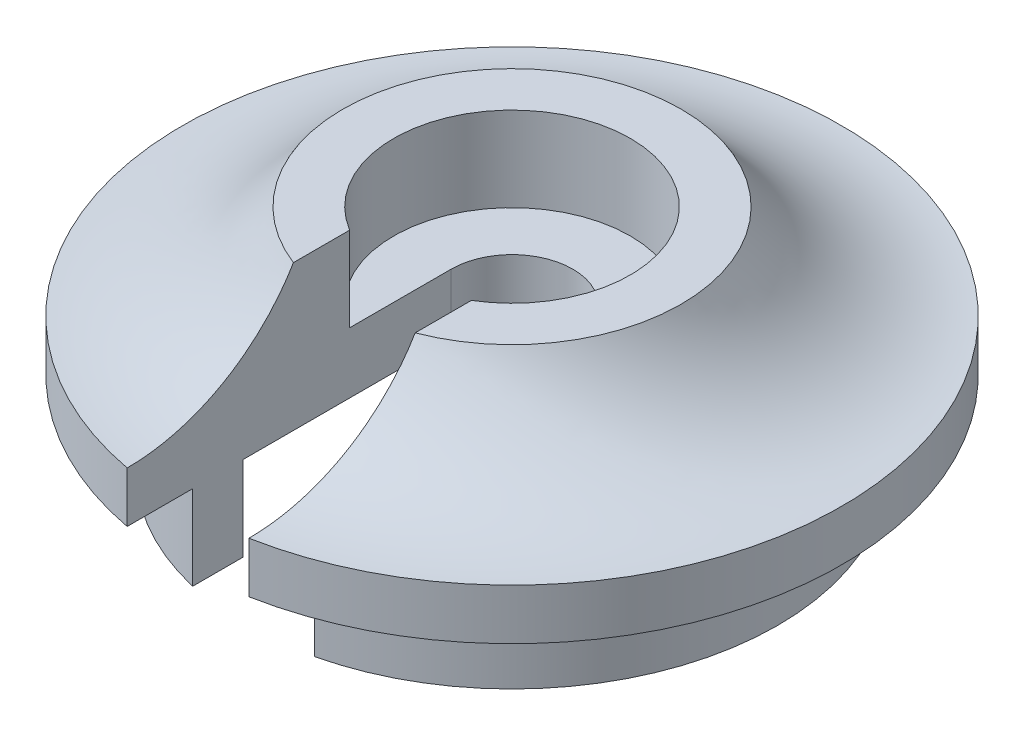
ISO-10303-21;
HEADER;
FILE_DESCRIPTION(('STEP AP214'),'2;1');
FILE_NAME('part.step','',(''),(''),'','','');
FILE_SCHEMA(('AUTOMOTIVE_DESIGN { 1 0 10303 214 1 1 1 1 }'));
ENDSEC;
DATA;
#1=APPLICATION_CONTEXT('core data for automotive mechanical design processes');
#2=APPLICATION_PROTOCOL_DEFINITION('international standard','automotive_design',2000,#1);
#3=PRODUCT_CONTEXT('',#1,'mechanical');
#4=PRODUCT('Part','Part','',(#3));
#5=PRODUCT_RELATED_PRODUCT_CATEGORY('part','',(#4));
#6=PRODUCT_DEFINITION_FORMATION('','',#4);
#7=PRODUCT_DEFINITION_CONTEXT('part definition',#1,'design');
#8=PRODUCT_DEFINITION('design','',#6,#7);
#9=PRODUCT_DEFINITION_SHAPE('','',#8);
#10=(LENGTH_UNIT() NAMED_UNIT(*) SI_UNIT(.MILLI.,.METRE.));
#11=(NAMED_UNIT(*) PLANE_ANGLE_UNIT() SI_UNIT($,.RADIAN.));
#12=(NAMED_UNIT(*) SI_UNIT($,.STERADIAN.) SOLID_ANGLE_UNIT());
#13=UNCERTAINTY_MEASURE_WITH_UNIT(LENGTH_MEASURE(1.E-05),#10,'distance_accuracy_value','');
#14=(GEOMETRIC_REPRESENTATION_CONTEXT(3) GLOBAL_UNCERTAINTY_ASSIGNED_CONTEXT((#13)) GLOBAL_UNIT_ASSIGNED_CONTEXT((#10,
#11,#12)) REPRESENTATION_CONTEXT('',''));
#15=CARTESIAN_POINT('',(0.,0.,0.));
#16=DIRECTION('',(0.,0.,1.));
#17=DIRECTION('',(1.,0.,0.));
#18=AXIS2_PLACEMENT_3D('',#15,#16,#17);
#19=CARTESIAN_POINT('',(0.,1.8,0.));
#20=DIRECTION('',(0.,-1.,0.));
#21=DIRECTION('',(0.,0.,-1.));
#22=AXIS2_PLACEMENT_3D('',#19,#20,#21);
#23=PLANE('',#22);
#24=DIRECTION('',(0.,0.,-1.));
#25=VECTOR('',#24,1.);
#26=CARTESIAN_POINT('',(1.8,1.8,0.));
#27=LINE('',#26,#25);
#28=CARTESIAN_POINT('',(1.8,1.8,3.00166620396073));
#29=VERTEX_POINT('',#28);
#30=CARTESIAN_POINT('',(1.8,1.8,0.));
#31=VERTEX_POINT('',#30);
#32=EDGE_CURVE('E124',#29,#31,#27,.T.);
#33=ORIENTED_EDGE('',*,*,#32,.F.);
#34=CARTESIAN_POINT('',(0.,1.8,0.));
#35=DIRECTION('',(0.,-1.,0.));
#36=DIRECTION('',(0.,0.,-1.));
#37=AXIS2_PLACEMENT_3D('',#34,#35,#36);
#38=CIRCLE('',#37,3.5);
#39=CARTESIAN_POINT('',(-1.8,1.8,3.00166620396073));
#40=VERTEX_POINT('',#39);
#41=EDGE_CURVE('E120',#40,#29,#38,.T.);
#42=ORIENTED_EDGE('',*,*,#41,.F.);
#43=DIRECTION('',(0.,0.,-1.));
#44=VECTOR('',#43,1.);
#45=CARTESIAN_POINT('',(-1.8,1.8,0.));
#46=LINE('',#45,#44);
#47=CARTESIAN_POINT('',(-1.8,1.8,0.));
#48=VERTEX_POINT('',#47);
#49=EDGE_CURVE('E167',#40,#48,#46,.T.);
#50=ORIENTED_EDGE('',*,*,#49,.T.);
#51=CARTESIAN_POINT('',(0.,1.8,0.));
#52=DIRECTION('',(0.,-1.,0.));
#53=DIRECTION('',(0.,0.,-1.));
#54=AXIS2_PLACEMENT_3D('',#51,#52,#53);
#55=CIRCLE('',#54,1.8);
#56=EDGE_CURVE('E168',#48,#31,#55,.T.);
#57=ORIENTED_EDGE('',*,*,#56,.T.);
#58=EDGE_LOOP('',(#33,#42,#50,#57));
#59=FACE_BOUND('',#58,.T.);
#60=ADVANCED_FACE('F32',(#59),#23,.F.);
#61=CARTESIAN_POINT('',(0.,-12.4205047617621,0.));
#62=DIRECTION('',(0.,-1.,0.));
#63=DIRECTION('',(0.,0.,-1.));
#64=AXIS2_PLACEMENT_3D('',#61,#62,#63);
#65=CYLINDRICAL_SURFACE('',#64,3.5);
#66=DIRECTION('',(0.,-1.,0.));
#67=VECTOR('',#66,1.);
#68=CARTESIAN_POINT('',(1.8,-12.4205047617621,3.00166620396073));
#69=LINE('',#68,#67);
#70=CARTESIAN_POINT('',(1.8,4.3,3.00166620396073));
#71=VERTEX_POINT('',#70);
#72=EDGE_CURVE('E54',#71,#29,#69,.T.);
#73=ORIENTED_EDGE('',*,*,#72,.F.);
#74=CARTESIAN_POINT('',(0.,4.3,0.));
#75=DIRECTION('',(0.,-1.,0.));
#76=DIRECTION('',(0.,0.,-1.));
#77=AXIS2_PLACEMENT_3D('',#74,#75,#76);
#78=CIRCLE('',#77,3.5);
#79=CARTESIAN_POINT('',(-1.8,4.3,3.00166620396073));
#80=VERTEX_POINT('',#79);
#81=EDGE_CURVE('E155',#80,#71,#78,.T.);
#82=ORIENTED_EDGE('',*,*,#81,.F.);
#83=DIRECTION('',(0.,-1.,0.));
#84=VECTOR('',#83,1.);
#85=CARTESIAN_POINT('',(-1.8,-12.4205047617621,3.00166620396073));
#86=LINE('',#85,#84);
#87=EDGE_CURVE('E164',#80,#40,#86,.T.);
#88=ORIENTED_EDGE('',*,*,#87,.T.);
#89=ORIENTED_EDGE('',*,*,#41,.T.);
#90=EDGE_LOOP('',(#73,#82,#88,#89));
#91=FACE_BOUND('',#90,.T.);
#92=ADVANCED_FACE('F162',(#91),#65,.F.);
#93=CARTESIAN_POINT('',(-3.5,4.3,0.));
#94=DIRECTION('',(0.,-1.,0.));
#95=DIRECTION('',(0.,0.,-1.));
#96=AXIS2_PLACEMENT_3D('',#93,#94,#95);
#97=PLANE('',#96);
#98=DIRECTION('',(0.,0.,1.));
#99=VECTOR('',#98,1.);
#100=CARTESIAN_POINT('',(1.8,4.3,0.));
#101=LINE('',#100,#99);
#102=CARTESIAN_POINT('',(1.8,4.3,4.66476151587624));
#103=VERTEX_POINT('',#102);
#104=EDGE_CURVE('E229',#71,#103,#101,.T.);
#105=ORIENTED_EDGE('',*,*,#104,.T.);
#106=CARTESIAN_POINT('',(0.,4.29999999999999,0.));
#107=DIRECTION('',(0.,-1.,0.));
#108=DIRECTION('',(0.,0.,-1.));
#109=AXIS2_PLACEMENT_3D('',#106,#107,#108);
#110=CIRCLE('',#109,5.);
#111=CARTESIAN_POINT('',(-1.8,4.3,4.66476151587624));
#112=VERTEX_POINT('',#111);
#113=EDGE_CURVE('E152',#112,#103,#110,.T.);
#114=ORIENTED_EDGE('',*,*,#113,.F.);
#115=DIRECTION('',(0.,0.,1.));
#116=VECTOR('',#115,1.);
#117=CARTESIAN_POINT('',(-1.8,4.3,0.));
#118=LINE('',#117,#116);
#119=EDGE_CURVE('E224',#80,#112,#118,.T.);
#120=ORIENTED_EDGE('',*,*,#119,.F.);
#121=ORIENTED_EDGE('',*,*,#81,.T.);
#122=EDGE_LOOP('',(#105,#114,#120,#121));
#123=FACE_BOUND('',#122,.T.);
#124=ADVANCED_FACE('F237',(#123),#97,.F.);
#125=CARTESIAN_POINT('',(0.,6.92901785714286,0.));
#126=DIRECTION('',(0.,-1.,0.));
#127=DIRECTION('',(0.,0.,-1.));
#128=AXIS2_PLACEMENT_3D('',#125,#126,#127);
#129=TOROIDAL_SURFACE('',#128,9.75,5.42901785714286);
#130=CARTESIAN_POINT('',(1.8,3.92242837668251,4.90998753351009));
#131=CARTESIAN_POINT('',(1.8,4.15501564440684,4.74523938204273));
#132=CARTESIAN_POINT('',(1.8,4.40030481477085,4.59811686171769));
#133=CARTESIAN_POINT('',(1.8,4.78315145276321,4.40777000140697));
#134=CARTESIAN_POINT('',(1.8,4.91335495913294,4.3493450382898));
#135=CARTESIAN_POINT('',(1.8,5.17804176112532,4.24320752114166));
#136=CARTESIAN_POINT('',(1.8,5.31252343810997,4.1954909693673));
#137=CARTESIAN_POINT('',(1.8,5.59434688679006,4.10844522356162));
#138=CARTESIAN_POINT('',(1.8,5.74193711157612,4.06991830809536));
#139=CARTESIAN_POINT('',(1.8,6.0400092335047,4.00634840981264));
#140=CARTESIAN_POINT('',(1.8,6.19049126776145,3.9813060680049));
#141=CARTESIAN_POINT('',(1.8,6.49305278215392,3.94515161963154));
#142=CARTESIAN_POINT('',(1.8,6.64513148413425,3.93403301847129));
#143=CARTESIAN_POINT('',(1.8,6.94965850568551,3.9259109939448));
#144=CARTESIAN_POINT('',(1.8,7.10210679603123,3.92890648869584));
#145=CARTESIAN_POINT('',(1.8,7.39438445066581,3.94818074723637));
#146=CARTESIAN_POINT('',(1.8,7.53428350448707,3.963421347587));
#147=CARTESIAN_POINT('',(1.8,7.81234361615305,4.00564842053788));
#148=CARTESIAN_POINT('',(1.8,7.95050405356557,4.0326389703341));
#149=CARTESIAN_POINT('',(1.8,8.22408824364149,4.09797963673276));
#150=CARTESIAN_POINT('',(1.8,8.35951246033949,4.13632780963116));
#151=CARTESIAN_POINT('',(1.8,8.62682081693166,4.22388470744956));
#152=CARTESIAN_POINT('',(1.8,8.75870355535859,4.27309766286286));
#153=CARTESIAN_POINT('',(1.8,9.15186611352468,4.43791024749679));
#154=CARTESIAN_POINT('',(1.8,9.4065552069623,4.56968911237421));
#155=CARTESIAN_POINT('',(1.8,9.89246743055802,4.87077934978184));
#156=CARTESIAN_POINT('',(1.8,10.1236840930827,5.04010102622064));
#157=CARTESIAN_POINT('',(1.8,10.5767334651923,5.42727775270896));
#158=CARTESIAN_POINT('',(1.8,10.7960928746517,5.64803686565021));
#159=CARTESIAN_POINT('',(1.8,11.1966611181133,6.12182055848708));
#160=CARTESIAN_POINT('',(1.8,11.3778607170834,6.37485292507801));
#161=CARTESIAN_POINT('',(1.8,11.7047897766675,6.9188796819011));
#162=CARTESIAN_POINT('',(1.8,11.8485170755275,7.2110812622271));
#163=CARTESIAN_POINT('',(1.8,12.0847023813046,7.81553880862246));
#164=CARTESIAN_POINT('',(1.8,12.1771593867329,8.12779516629905));
#165=CARTESIAN_POINT('',(1.8,12.3073755550677,8.76246412675347));
#166=CARTESIAN_POINT('',(1.8,12.3453152824867,9.08483957197391));
#167=CARTESIAN_POINT('',(1.8,12.3653517911726,9.73133318935685));
#168=CARTESIAN_POINT('',(1.8,12.3474537606586,10.055451196814));
#169=CARTESIAN_POINT('',(1.8,12.2567241746554,10.6892988990175));
#170=CARTESIAN_POINT('',(1.8,12.1849970506353,10.9991866768411));
#171=CARTESIAN_POINT('',(1.8,11.9895536002497,11.602116053596));
#172=CARTESIAN_POINT('',(1.8,11.8658425377153,11.8951593547644));
#173=CARTESIAN_POINT('',(1.8,11.5724851634357,12.4503938089581));
#174=CARTESIAN_POINT('',(1.8,11.4037229469594,12.7130522363265));
#175=CARTESIAN_POINT('',(1.8,11.0239598170645,13.2058211253116));
#176=CARTESIAN_POINT('',(1.8,10.8129620371761,13.4359339993796));
#177=CARTESIAN_POINT('',(1.8,10.3576892374769,13.8540096178026));
#178=CARTESIAN_POINT('',(1.8,10.1138759636667,14.042475332364));
#179=CARTESIAN_POINT('',(1.8,9.59786187933257,14.3754115395045));
#180=CARTESIAN_POINT('',(1.8,9.32566240777807,14.5198841059696));
#181=CARTESIAN_POINT('',(1.8,8.76293348737673,14.7595959494547));
#182=CARTESIAN_POINT('',(1.8,8.47256579832585,14.8552150803274));
#183=CARTESIAN_POINT('',(1.8,7.87986657078078,14.996128580148));
#184=CARTESIAN_POINT('',(1.8,7.57753534984416,15.041424283944));
#185=CARTESIAN_POINT('',(1.8,6.97078335504755,15.080282965948));
#186=CARTESIAN_POINT('',(1.8,6.66637574328409,15.0740517693794));
#187=CARTESIAN_POINT('',(1.8,6.06293800709101,15.0105306219821));
#188=CARTESIAN_POINT('',(1.8,5.76390782997981,14.9532411716384));
#189=CARTESIAN_POINT('',(1.8,5.17992153054009,14.7893345081118));
#190=CARTESIAN_POINT('',(1.8,4.89495553698663,14.682752452903));
#191=CARTESIAN_POINT('',(1.8,4.3469033317737,14.4233708239356));
#192=CARTESIAN_POINT('',(1.8,4.08381720743461,14.270571065738));
#193=CARTESIAN_POINT('',(1.8,3.58626839016269,13.9227479785408));
#194=CARTESIAN_POINT('',(1.8,3.35187692197016,13.7276227871982));
#195=CARTESIAN_POINT('',(1.8,2.91894826613433,13.3009999149899));
#196=CARTESIAN_POINT('',(1.8,2.72041179422939,13.0695015082137));
#197=CARTESIAN_POINT('',(1.8,2.36350846815839,12.575284754221));
#198=CARTESIAN_POINT('',(1.8,2.20538634655428,12.312389717944));
#199=CARTESIAN_POINT('',(1.8,1.93502392417449,11.7639916911295));
#200=CARTESIAN_POINT('',(1.8,1.82278556065553,11.4784877466294));
#201=CARTESIAN_POINT('',(1.8,1.64606386766384,10.8898948203889));
#202=CARTESIAN_POINT('',(1.8,1.58207921618902,10.5866561987485));
#203=CARTESIAN_POINT('',(1.8,1.50510981224103,9.97379972794332));
#204=CARTESIAN_POINT('',(1.8,1.49212646536925,9.66418170319797));
#205=CARTESIAN_POINT('',(1.8,1.51721237939024,9.04230027919704));
#206=CARTESIAN_POINT('',(1.8,1.55606329664862,8.73006855470882));
#207=CARTESIAN_POINT('',(1.8,1.68459587059352,8.11619067654431));
#208=CARTESIAN_POINT('',(1.8,1.77429256900763,7.81454768339082));
#209=CARTESIAN_POINT('',(1.8,2.00390597989568,7.22399632539631));
#210=CARTESIAN_POINT('',(1.8,2.14480264306273,6.93546940965078));
#211=CARTESIAN_POINT('',(1.8,2.47219554733255,6.38576898542927));
#212=CARTESIAN_POINT('',(1.8,2.65865950399103,6.1245762969549));
#213=CARTESIAN_POINT('',(1.8,3.02033847115876,5.69759464726007));
#214=CARTESIAN_POINT('',(1.8,3.18674552913167,5.52426481536478));
#215=CARTESIAN_POINT('',(1.8,3.53991351924427,5.19979236685349));
#216=CARTESIAN_POINT('',(1.8,3.72667213273105,5.04864722733057));
#217=CARTESIAN_POINT('',(1.8,3.92242837668251,4.90998753351009));
#218=B_SPLINE_CURVE_WITH_KNOTS('',3,(#130,#131,#132,#133,#134,#135,#136,#137,#138,#139,#140,
#141,#142,#143,#144,#145,#146,#147,#148,#149,#150,#151,#152,#153,#154,#155,#156,#157,#158,#159,
#160,#161,#162,#163,#164,#165,#166,#167,#168,#169,#170,#171,#172,#173,#174,#175,#176,#177,#178,
#179,#180,#181,#182,#183,#184,#185,#186,#187,#188,#189,#190,#191,#192,#193,#194,#195,#196,#197,
#198,#199,#200,#201,#202,#203,#204,#205,#206,#207,#208,#209,#210,#211,#212,#213,#214,#215,#216,
#217),.UNSPECIFIED.,.T.,.F.,(4,2,2,2,2,2,2,2,2,2,2,2,2,2,2,2,2,2,2,2,2,2,2,2,2,2,2,2,2,2,2,2,2,
2,2,2,2,2,2,2,2,2,2,4),(0.,0.854238353119371,1.28199478277979,1.70959125259945,2.16658819642981,
2.62360686235413,3.08041227683007,3.53718267653464,3.95886180183834,4.38068736526487,
4.80244078060678,5.22435870745888,6.08071957579317,6.93731577042024,7.86681273634494,
8.79653439141203,9.76879332785038,10.7410712552481,11.7101214577032,12.6790816226084,
13.6286869304102,14.5781961054787,15.5102906823592,16.4423161311337,17.3623820818878,
18.2824046529888,19.1951604684255,20.1078920720856,21.0169795178392,21.9260580526009,
22.8344891842686,23.742923941221,24.6535697278928,25.5642336908905,26.4802881513772,
27.3963812845772,28.3218167256689,29.2472776716807,30.186853419945,31.1267072684409,
32.0855886517571,33.0437926269355,33.7628411244278,34.4818077861977),.UNSPECIFIED.);
#219=CARTESIAN_POINT('',(1.8,1.5,9.58240575221066));
#220=VERTEX_POINT('',#219);
#221=EDGE_CURVE('E207',#220,#103,#218,.T.);
#222=ORIENTED_EDGE('',*,*,#221,.F.);
#223=CARTESIAN_POINT('',(0.,1.5,0.));
#224=DIRECTION('',(0.,-1.,0.));
#225=DIRECTION('',(0.,0.,-1.));
#226=AXIS2_PLACEMENT_3D('',#223,#224,#225);
#227=CIRCLE('',#226,9.75);
#228=CARTESIAN_POINT('',(-1.8,1.5,9.58240575221066));
#229=VERTEX_POINT('',#228);
#230=EDGE_CURVE('E149',#229,#220,#227,.T.);
#231=ORIENTED_EDGE('',*,*,#230,.F.);
#232=CARTESIAN_POINT('',(-1.8,3.92242837668251,4.90998753351009));
#233=CARTESIAN_POINT('',(-1.8,4.15501564440684,4.74523938204273));
#234=CARTESIAN_POINT('',(-1.8,4.40030481477085,4.59811686171769));
#235=CARTESIAN_POINT('',(-1.8,4.78315145276321,4.40777000140697));
#236=CARTESIAN_POINT('',(-1.8,4.91335495913294,4.3493450382898));
#237=CARTESIAN_POINT('',(-1.8,5.17804176112532,4.24320752114166));
#238=CARTESIAN_POINT('',(-1.8,5.31252343810997,4.1954909693673));
#239=CARTESIAN_POINT('',(-1.8,5.59434688679006,4.10844522356162));
#240=CARTESIAN_POINT('',(-1.8,5.74193711157612,4.06991830809536));
#241=CARTESIAN_POINT('',(-1.8,6.0400092335047,4.00634840981264));
#242=CARTESIAN_POINT('',(-1.8,6.19049126776145,3.9813060680049));
#243=CARTESIAN_POINT('',(-1.8,6.49305278215392,3.94515161963154));
#244=CARTESIAN_POINT('',(-1.8,6.64513148413425,3.93403301847129));
#245=CARTESIAN_POINT('',(-1.8,6.94965850568551,3.9259109939448));
#246=CARTESIAN_POINT('',(-1.8,7.10210679603123,3.92890648869584));
#247=CARTESIAN_POINT('',(-1.8,7.39438445066581,3.94818074723637));
#248=CARTESIAN_POINT('',(-1.8,7.53428350448707,3.963421347587));
#249=CARTESIAN_POINT('',(-1.8,7.81234361615305,4.00564842053788));
#250=CARTESIAN_POINT('',(-1.8,7.95050405356557,4.0326389703341));
#251=CARTESIAN_POINT('',(-1.8,8.22408824364149,4.09797963673276));
#252=CARTESIAN_POINT('',(-1.8,8.35951246033949,4.13632780963116));
#253=CARTESIAN_POINT('',(-1.8,8.62682081693166,4.22388470744956));
#254=CARTESIAN_POINT('',(-1.8,8.75870355535859,4.27309766286286));
#255=CARTESIAN_POINT('',(-1.8,9.15186611352468,4.43791024749679));
#256=CARTESIAN_POINT('',(-1.8,9.4065552069623,4.56968911237421));
#257=CARTESIAN_POINT('',(-1.8,9.89246743055802,4.87077934978184));
#258=CARTESIAN_POINT('',(-1.8,10.1236840930827,5.04010102622064));
#259=CARTESIAN_POINT('',(-1.8,10.5767334651923,5.42727775270896));
#260=CARTESIAN_POINT('',(-1.8,10.7960928746517,5.64803686565021));
#261=CARTESIAN_POINT('',(-1.8,11.1966611181133,6.12182055848708));
#262=CARTESIAN_POINT('',(-1.8,11.3778607170834,6.37485292507801));
#263=CARTESIAN_POINT('',(-1.8,11.7047897766675,6.9188796819011));
#264=CARTESIAN_POINT('',(-1.8,11.8485170755275,7.2110812622271));
#265=CARTESIAN_POINT('',(-1.8,12.0847023813046,7.81553880862246));
#266=CARTESIAN_POINT('',(-1.8,12.1771593867329,8.12779516629905));
#267=CARTESIAN_POINT('',(-1.8,12.3073755550677,8.76246412675347));
#268=CARTESIAN_POINT('',(-1.8,12.3453152824867,9.08483957197391));
#269=CARTESIAN_POINT('',(-1.8,12.3653517911726,9.73133318935685));
#270=CARTESIAN_POINT('',(-1.8,12.3474537606586,10.055451196814));
#271=CARTESIAN_POINT('',(-1.8,12.2567241746554,10.6892988990175));
#272=CARTESIAN_POINT('',(-1.8,12.1849970506353,10.9991866768411));
#273=CARTESIAN_POINT('',(-1.8,11.9895536002497,11.602116053596));
#274=CARTESIAN_POINT('',(-1.8,11.8658425377153,11.8951593547644));
#275=CARTESIAN_POINT('',(-1.8,11.5724851634357,12.4503938089581));
#276=CARTESIAN_POINT('',(-1.8,11.4037229469594,12.7130522363265));
#277=CARTESIAN_POINT('',(-1.8,11.0239598170645,13.2058211253116));
#278=CARTESIAN_POINT('',(-1.8,10.8129620371761,13.4359339993796));
#279=CARTESIAN_POINT('',(-1.8,10.3576892374769,13.8540096178026));
#280=CARTESIAN_POINT('',(-1.8,10.1138759636667,14.042475332364));
#281=CARTESIAN_POINT('',(-1.8,9.59786187933257,14.3754115395045));
#282=CARTESIAN_POINT('',(-1.8,9.32566240777807,14.5198841059696));
#283=CARTESIAN_POINT('',(-1.8,8.76293348737673,14.7595959494547));
#284=CARTESIAN_POINT('',(-1.8,8.47256579832585,14.8552150803274));
#285=CARTESIAN_POINT('',(-1.8,7.87986657078078,14.996128580148));
#286=CARTESIAN_POINT('',(-1.8,7.57753534984416,15.041424283944));
#287=CARTESIAN_POINT('',(-1.8,6.97078335504755,15.080282965948));
#288=CARTESIAN_POINT('',(-1.8,6.66637574328409,15.0740517693794));
#289=CARTESIAN_POINT('',(-1.8,6.06293800709101,15.0105306219821));
#290=CARTESIAN_POINT('',(-1.8,5.76390782997981,14.9532411716384));
#291=CARTESIAN_POINT('',(-1.8,5.17992153054009,14.7893345081118));
#292=CARTESIAN_POINT('',(-1.8,4.89495553698663,14.682752452903));
#293=CARTESIAN_POINT('',(-1.8,4.3469033317737,14.4233708239356));
#294=CARTESIAN_POINT('',(-1.8,4.08381720743461,14.270571065738));
#295=CARTESIAN_POINT('',(-1.8,3.58626839016269,13.9227479785408));
#296=CARTESIAN_POINT('',(-1.8,3.35187692197016,13.7276227871982));
#297=CARTESIAN_POINT('',(-1.8,2.91894826613433,13.3009999149899));
#298=CARTESIAN_POINT('',(-1.8,2.72041179422939,13.0695015082137));
#299=CARTESIAN_POINT('',(-1.8,2.36350846815839,12.575284754221));
#300=CARTESIAN_POINT('',(-1.8,2.20538634655428,12.312389717944));
#301=CARTESIAN_POINT('',(-1.8,1.93502392417449,11.7639916911295));
#302=CARTESIAN_POINT('',(-1.8,1.82278556065553,11.4784877466294));
#303=CARTESIAN_POINT('',(-1.8,1.64606386766384,10.8898948203889));
#304=CARTESIAN_POINT('',(-1.8,1.58207921618902,10.5866561987485));
#305=CARTESIAN_POINT('',(-1.8,1.50510981224103,9.97379972794332));
#306=CARTESIAN_POINT('',(-1.8,1.49212646536925,9.66418170319797));
#307=CARTESIAN_POINT('',(-1.8,1.51721237939024,9.04230027919704));
#308=CARTESIAN_POINT('',(-1.8,1.55606329664862,8.73006855470882));
#309=CARTESIAN_POINT('',(-1.8,1.68459587059352,8.11619067654431));
#310=CARTESIAN_POINT('',(-1.8,1.77429256900763,7.81454768339082));
#311=CARTESIAN_POINT('',(-1.8,2.00390597989568,7.22399632539631));
#312=CARTESIAN_POINT('',(-1.8,2.14480264306273,6.93546940965078));
#313=CARTESIAN_POINT('',(-1.8,2.47219554733255,6.38576898542927));
#314=CARTESIAN_POINT('',(-1.8,2.65865950399103,6.1245762969549));
#315=CARTESIAN_POINT('',(-1.8,3.02033847115876,5.69759464726007));
#316=CARTESIAN_POINT('',(-1.8,3.18674552913167,5.52426481536478));
#317=CARTESIAN_POINT('',(-1.8,3.53991351924427,5.19979236685349));
#318=CARTESIAN_POINT('',(-1.8,3.72667213273105,5.04864722733057));
#319=CARTESIAN_POINT('',(-1.8,3.92242837668251,4.90998753351009));
#320=B_SPLINE_CURVE_WITH_KNOTS('',3,(#232,#233,#234,#235,#236,#237,#238,#239,#240,#241,#242,
#243,#244,#245,#246,#247,#248,#249,#250,#251,#252,#253,#254,#255,#256,#257,#258,#259,#260,#261,
#262,#263,#264,#265,#266,#267,#268,#269,#270,#271,#272,#273,#274,#275,#276,#277,#278,#279,#280,
#281,#282,#283,#284,#285,#286,#287,#288,#289,#290,#291,#292,#293,#294,#295,#296,#297,#298,#299,
#300,#301,#302,#303,#304,#305,#306,#307,#308,#309,#310,#311,#312,#313,#314,#315,#316,#317,#318,
#319),.UNSPECIFIED.,.T.,.F.,(4,2,2,2,2,2,2,2,2,2,2,2,2,2,2,2,2,2,2,2,2,2,2,2,2,2,2,2,2,2,2,2,2,
2,2,2,2,2,2,2,2,2,2,4),(0.,0.854238353119371,1.28199478277979,1.70959125259945,2.16658819642981,
2.62360686235413,3.08041227683007,3.53718267653464,3.95886180183834,4.38068736526487,
4.80244078060678,5.22435870745888,6.08071957579317,6.93731577042024,7.86681273634494,
8.79653439141203,9.76879332785038,10.7410712552481,11.7101214577032,12.6790816226084,
13.6286869304102,14.5781961054787,15.5102906823592,16.4423161311337,17.3623820818878,
18.2824046529888,19.1951604684255,20.1078920720856,21.0169795178392,21.9260580526009,
22.8344891842686,23.742923941221,24.6535697278928,25.5642336908905,26.4802881513772,
27.3963812845772,28.3218167256689,29.2472776716807,30.186853419945,31.1267072684409,
32.0855886517571,33.0437926269355,33.7628411244278,34.4818077861977),.UNSPECIFIED.);
#321=EDGE_CURVE('E183',#229,#112,#320,.T.);
#322=ORIENTED_EDGE('',*,*,#321,.T.);
#323=ORIENTED_EDGE('',*,*,#113,.T.);
#324=EDGE_LOOP('',(#222,#231,#322,#323));
#325=FACE_BOUND('',#324,.T.);
#326=ADVANCED_FACE('F191',(#325),#129,.F.);
#327=CARTESIAN_POINT('',(0.,-12.4205047617621,0.));
#328=DIRECTION('',(0.,-1.,0.));
#329=DIRECTION('',(0.,0.,-1.));
#330=AXIS2_PLACEMENT_3D('',#327,#328,#329);
#331=CYLINDRICAL_SURFACE('',#330,9.75);
#332=DIRECTION('',(0.,1.,0.));
#333=VECTOR('',#332,1.);
#334=CARTESIAN_POINT('',(1.8,-2.5,9.58240575221066));
#335=LINE('',#334,#333);
#336=CARTESIAN_POINT('',(1.8,0.,9.58240575221066));
#337=VERTEX_POINT('',#336);
#338=EDGE_CURVE('E170',#337,#220,#335,.T.);
#339=ORIENTED_EDGE('',*,*,#338,.F.);
#340=CARTESIAN_POINT('',(0.,0.,0.));
#341=DIRECTION('',(0.,-1.,0.));
#342=DIRECTION('',(0.,0.,-1.));
#343=AXIS2_PLACEMENT_3D('',#340,#341,#342);
#344=CIRCLE('',#343,9.75);
#345=CARTESIAN_POINT('',(-1.8,0.,9.58240575221066));
#346=VERTEX_POINT('',#345);
#347=EDGE_CURVE('E146',#346,#337,#344,.T.);
#348=ORIENTED_EDGE('',*,*,#347,.F.);
#349=DIRECTION('',(0.,1.,0.));
#350=VECTOR('',#349,1.);
#351=CARTESIAN_POINT('',(-1.8,-2.5,9.58240575221066));
#352=LINE('',#351,#350);
#353=EDGE_CURVE('E174',#346,#229,#352,.T.);
#354=ORIENTED_EDGE('',*,*,#353,.T.);
#355=ORIENTED_EDGE('',*,*,#230,.T.);
#356=EDGE_LOOP('',(#339,#348,#354,#355));
#357=FACE_BOUND('',#356,.T.);
#358=ADVANCED_FACE('F244',(#357),#331,.T.);
#359=CARTESIAN_POINT('',(-7.855,0.,0.));
#360=DIRECTION('',(0.,1.,0.));
#361=DIRECTION('',(0.,0.,1.));
#362=AXIS2_PLACEMENT_3D('',#359,#360,#361);
#363=PLANE('',#362);
#364=DIRECTION('',(0.,0.,1.));
#365=VECTOR('',#364,1.);
#366=CARTESIAN_POINT('',(1.8,0.,0.));
#367=LINE('',#366,#365);
#368=CARTESIAN_POINT('',(1.8,0.,7.64598097041838));
#369=VERTEX_POINT('',#368);
#370=EDGE_CURVE('E211',#369,#337,#367,.T.);
#371=ORIENTED_EDGE('',*,*,#370,.F.);
#372=CARTESIAN_POINT('',(0.,0.,0.));
#373=DIRECTION('',(0.,-1.,0.));
#374=DIRECTION('',(0.,0.,-1.));
#375=AXIS2_PLACEMENT_3D('',#372,#373,#374);
#376=CIRCLE('',#375,7.855);
#377=CARTESIAN_POINT('',(-1.8,0.,7.64598097041838));
#378=VERTEX_POINT('',#377);
#379=EDGE_CURVE('E143',#378,#369,#376,.T.);
#380=ORIENTED_EDGE('',*,*,#379,.F.);
#381=DIRECTION('',(0.,0.,1.));
#382=VECTOR('',#381,1.);
#383=CARTESIAN_POINT('',(-1.8,0.,0.));
#384=LINE('',#383,#382);
#385=EDGE_CURVE('E180',#378,#346,#384,.T.);
#386=ORIENTED_EDGE('',*,*,#385,.T.);
#387=ORIENTED_EDGE('',*,*,#347,.T.);
#388=EDGE_LOOP('',(#371,#380,#386,#387));
#389=FACE_BOUND('',#388,.T.);
#390=ADVANCED_FACE('F247',(#389),#363,.F.);
#391=CARTESIAN_POINT('',(0.,-12.4205047617621,0.));
#392=DIRECTION('',(0.,-1.,0.));
#393=DIRECTION('',(0.,0.,-1.));
#394=AXIS2_PLACEMENT_3D('',#391,#392,#393);
#395=CYLINDRICAL_SURFACE('',#394,7.855);
#396=DIRECTION('',(0.,-1.,0.));
#397=VECTOR('',#396,1.);
#398=CARTESIAN_POINT('',(1.8,-12.4205047617621,7.64598097041838));
#399=LINE('',#398,#397);
#400=CARTESIAN_POINT('',(1.8,-2.5,7.64598097041838));
#401=VERTEX_POINT('',#400);
#402=EDGE_CURVE('E213',#401,#369,#399,.F.);
#403=ORIENTED_EDGE('',*,*,#402,.F.);
#404=CARTESIAN_POINT('',(0.,-2.5,0.));
#405=DIRECTION('',(0.,-1.,0.));
#406=DIRECTION('',(0.,0.,-1.));
#407=AXIS2_PLACEMENT_3D('',#404,#405,#406);
#408=CIRCLE('',#407,7.855);
#409=CARTESIAN_POINT('',(-1.8,-2.5,7.64598097041838));
#410=VERTEX_POINT('',#409);
#411=EDGE_CURVE('E136',#410,#401,#408,.T.);
#412=ORIENTED_EDGE('',*,*,#411,.F.);
#413=DIRECTION('',(0.,-1.,0.));
#414=VECTOR('',#413,1.);
#415=CARTESIAN_POINT('',(-1.8,-12.4205047617621,7.64598097041838));
#416=LINE('',#415,#414);
#417=EDGE_CURVE('E172',#410,#378,#416,.F.);
#418=ORIENTED_EDGE('',*,*,#417,.T.);
#419=ORIENTED_EDGE('',*,*,#379,.T.);
#420=EDGE_LOOP('',(#403,#412,#418,#419));
#421=FACE_BOUND('',#420,.T.);
#422=ADVANCED_FACE('F250',(#421),#395,.T.);
#423=CARTESIAN_POINT('',(-6.415,-2.5,0.));
#424=DIRECTION('',(0.,1.,0.));
#425=DIRECTION('',(0.,0.,1.));
#426=AXIS2_PLACEMENT_3D('',#423,#424,#425);
#427=PLANE('',#426);
#428=DIRECTION('',(0.,0.,1.));
#429=VECTOR('',#428,1.);
#430=CARTESIAN_POINT('',(1.8,-2.5,0.));
#431=LINE('',#430,#429);
#432=CARTESIAN_POINT('',(1.8,-2.5,6.15729039432119));
#433=VERTEX_POINT('',#432);
#434=EDGE_CURVE('E217',#433,#401,#431,.T.);
#435=ORIENTED_EDGE('',*,*,#434,.F.);
#436=CARTESIAN_POINT('',(0.,-2.5,0.));
#437=DIRECTION('',(0.,-1.,0.));
#438=DIRECTION('',(0.,0.,-1.));
#439=AXIS2_PLACEMENT_3D('',#436,#437,#438);
#440=CIRCLE('',#439,6.415);
#441=CARTESIAN_POINT('',(-1.8,-2.5,6.15729039432119));
#442=VERTEX_POINT('',#441);
#443=EDGE_CURVE('E133',#442,#433,#440,.T.);
#444=ORIENTED_EDGE('',*,*,#443,.F.);
#445=DIRECTION('',(0.,0.,1.));
#446=VECTOR('',#445,1.);
#447=CARTESIAN_POINT('',(-1.8,-2.5,0.));
#448=LINE('',#447,#446);
#449=EDGE_CURVE('E125',#442,#410,#448,.T.);
#450=ORIENTED_EDGE('',*,*,#449,.T.);
#451=ORIENTED_EDGE('',*,*,#411,.T.);
#452=EDGE_LOOP('',(#435,#444,#450,#451));
#453=FACE_BOUND('',#452,.T.);
#454=ADVANCED_FACE('F221',(#453),#427,.F.);
#455=CARTESIAN_POINT('',(0.,-12.4205047617621,0.));
#456=DIRECTION('',(0.,-1.,0.));
#457=DIRECTION('',(0.,0.,-1.));
#458=AXIS2_PLACEMENT_3D('',#455,#456,#457);
#459=CYLINDRICAL_SURFACE('',#458,6.415);
#460=DIRECTION('',(0.,-1.,0.));
#461=VECTOR('',#460,1.);
#462=CARTESIAN_POINT('',(1.8,-12.4205047617621,6.15729039432119));
#463=LINE('',#462,#461);
#464=CARTESIAN_POINT('',(1.8,0.,6.15729039432119));
#465=VERTEX_POINT('',#464);
#466=EDGE_CURVE('E215',#465,#433,#463,.T.);
#467=ORIENTED_EDGE('',*,*,#466,.F.);
#468=CARTESIAN_POINT('',(0.,0.,0.));
#469=DIRECTION('',(0.,-1.,0.));
#470=DIRECTION('',(0.,0.,-1.));
#471=AXIS2_PLACEMENT_3D('',#468,#469,#470);
#472=CIRCLE('',#471,6.415);
#473=CARTESIAN_POINT('',(-1.8,0.,6.15729039432119));
#474=VERTEX_POINT('',#473);
#475=EDGE_CURVE('E130',#474,#465,#472,.T.);
#476=ORIENTED_EDGE('',*,*,#475,.F.);
#477=DIRECTION('',(0.,-1.,0.));
#478=VECTOR('',#477,1.);
#479=CARTESIAN_POINT('',(-1.8,-12.4205047617621,6.15729039432119));
#480=LINE('',#479,#478);
#481=EDGE_CURVE('E169',#474,#442,#480,.T.);
#482=ORIENTED_EDGE('',*,*,#481,.T.);
#483=ORIENTED_EDGE('',*,*,#443,.T.);
#484=EDGE_LOOP('',(#467,#476,#482,#483));
#485=FACE_BOUND('',#484,.T.);
#486=ADVANCED_FACE('F226',(#485),#459,.F.);
#487=CARTESIAN_POINT('',(0.,0.,0.));
#488=DIRECTION('',(0.,1.,0.));
#489=DIRECTION('',(0.,0.,1.));
#490=AXIS2_PLACEMENT_3D('',#487,#488,#489);
#491=PLANE('',#490);
#492=DIRECTION('',(0.,0.,1.));
#493=VECTOR('',#492,1.);
#494=CARTESIAN_POINT('',(1.8,0.,0.));
#495=LINE('',#494,#493);
#496=CARTESIAN_POINT('',(1.8,0.,0.));
#497=VERTEX_POINT('',#496);
#498=EDGE_CURVE('E11',#497,#465,#495,.T.);
#499=ORIENTED_EDGE('',*,*,#498,.F.);
#500=CARTESIAN_POINT('',(0.,0.,0.));
#501=DIRECTION('',(0.,1.,0.));
#502=DIRECTION('',(0.,0.,1.));
#503=AXIS2_PLACEMENT_3D('',#500,#501,#502);
#504=CIRCLE('',#503,1.8);
#505=CARTESIAN_POINT('',(-1.8,0.,0.));
#506=VERTEX_POINT('',#505);
#507=EDGE_CURVE('E112',#497,#506,#504,.T.);
#508=ORIENTED_EDGE('',*,*,#507,.T.);
#509=DIRECTION('',(0.,0.,1.));
#510=VECTOR('',#509,1.);
#511=CARTESIAN_POINT('',(-1.8,0.,0.));
#512=LINE('',#511,#510);
#513=EDGE_CURVE('E39',#506,#474,#512,.T.);
#514=ORIENTED_EDGE('',*,*,#513,.T.);
#515=ORIENTED_EDGE('',*,*,#475,.T.);
#516=EDGE_LOOP('',(#499,#508,#514,#515));
#517=FACE_BOUND('',#516,.T.);
#518=ADVANCED_FACE('F128',(#517),#491,.F.);
#519=CARTESIAN_POINT('',(1.8,-2.5,0.));
#520=DIRECTION('',(-1.,0.,0.));
#521=DIRECTION('',(0.,0.,1.));
#522=AXIS2_PLACEMENT_3D('',#519,#520,#521);
#523=PLANE('',#522);
#524=ORIENTED_EDGE('',*,*,#32,.T.);
#525=DIRECTION('',(0.,1.,0.));
#526=VECTOR('',#525,1.);
#527=CARTESIAN_POINT('',(1.8,-2.5,0.));
#528=LINE('',#527,#526);
#529=EDGE_CURVE('E115',#497,#31,#528,.T.);
#530=ORIENTED_EDGE('',*,*,#529,.F.);
#531=ORIENTED_EDGE('',*,*,#498,.T.);
#532=ORIENTED_EDGE('',*,*,#466,.T.);
#533=ORIENTED_EDGE('',*,*,#434,.T.);
#534=ORIENTED_EDGE('',*,*,#402,.T.);
#535=ORIENTED_EDGE('',*,*,#370,.T.);
#536=ORIENTED_EDGE('',*,*,#338,.T.);
#537=ORIENTED_EDGE('',*,*,#221,.T.);
#538=ORIENTED_EDGE('',*,*,#104,.F.);
#539=ORIENTED_EDGE('',*,*,#72,.T.);
#540=EDGE_LOOP('',(#524,#530,#531,#532,#533,#534,#535,#536,#537,#538,#539));
#541=FACE_BOUND('',#540,.T.);
#542=ADVANCED_FACE('F122',(#541),#523,.T.);
#543=CARTESIAN_POINT('',(-1.8,-2.5,0.));
#544=DIRECTION('',(-1.,0.,0.));
#545=DIRECTION('',(0.,0.,1.));
#546=AXIS2_PLACEMENT_3D('',#543,#544,#545);
#547=PLANE('',#546);
#548=ORIENTED_EDGE('',*,*,#87,.F.);
#549=ORIENTED_EDGE('',*,*,#119,.T.);
#550=ORIENTED_EDGE('',*,*,#321,.F.);
#551=ORIENTED_EDGE('',*,*,#353,.F.);
#552=ORIENTED_EDGE('',*,*,#385,.F.);
#553=ORIENTED_EDGE('',*,*,#417,.F.);
#554=ORIENTED_EDGE('',*,*,#449,.F.);
#555=ORIENTED_EDGE('',*,*,#481,.F.);
#556=ORIENTED_EDGE('',*,*,#513,.F.);
#557=DIRECTION('',(0.,1.,0.));
#558=VECTOR('',#557,1.);
#559=CARTESIAN_POINT('',(-1.8,-2.5,0.));
#560=LINE('',#559,#558);
#561=EDGE_CURVE('E46',#506,#48,#560,.T.);
#562=ORIENTED_EDGE('',*,*,#561,.T.);
#563=ORIENTED_EDGE('',*,*,#49,.F.);
#564=EDGE_LOOP('',(#548,#549,#550,#551,#552,#553,#554,#555,#556,#562,#563));
#565=FACE_BOUND('',#564,.T.);
#566=ADVANCED_FACE('F195',(#565),#547,.F.);
#567=CARTESIAN_POINT('',(0.,-2.5,0.));
#568=DIRECTION('',(0.,1.,0.));
#569=DIRECTION('',(0.,0.,1.));
#570=AXIS2_PLACEMENT_3D('',#567,#568,#569);
#571=CYLINDRICAL_SURFACE('',#570,1.8);
#572=ORIENTED_EDGE('',*,*,#561,.F.);
#573=ORIENTED_EDGE('',*,*,#507,.F.);
#574=ORIENTED_EDGE('',*,*,#529,.T.);
#575=ORIENTED_EDGE('',*,*,#56,.F.);
#576=EDGE_LOOP('',(#572,#573,#574,#575));
#577=FACE_BOUND('',#576,.T.);
#578=ADVANCED_FACE('F114',(#577),#571,.F.);
#579=CLOSED_SHELL('',(#60,#92,#124,#326,#358,#390,#422,#454,#486,#518,#542,#566,#578));
#580=MANIFOLD_SOLID_BREP('B2',#579);
#581=ADVANCED_BREP_SHAPE_REPRESENTATION('',(#18,#580),#14);
#582=SHAPE_DEFINITION_REPRESENTATION(#9,#581);
ENDSEC;
END-ISO-10303-21;
